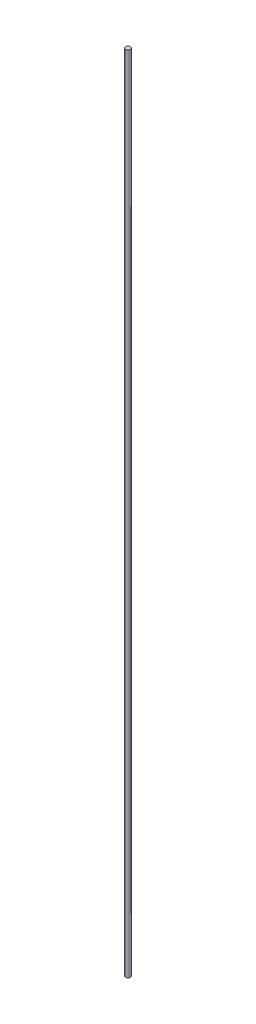
ISO-10303-21;
HEADER;
FILE_DESCRIPTION(('STEP AP214'),'2;1');
FILE_NAME('part.step','',(''),(''),'','','');
FILE_SCHEMA(('AUTOMOTIVE_DESIGN { 1 0 10303 214 1 1 1 1 }'));
ENDSEC;
DATA;
#1=APPLICATION_CONTEXT('core data for automotive mechanical design processes');
#2=APPLICATION_PROTOCOL_DEFINITION('international standard','automotive_design',2000,#1);
#3=PRODUCT_CONTEXT('',#1,'mechanical');
#4=PRODUCT('Part','Part','',(#3));
#5=PRODUCT_RELATED_PRODUCT_CATEGORY('part','',(#4));
#6=PRODUCT_DEFINITION_FORMATION('','',#4);
#7=PRODUCT_DEFINITION_CONTEXT('part definition',#1,'design');
#8=PRODUCT_DEFINITION('design','',#6,#7);
#9=PRODUCT_DEFINITION_SHAPE('','',#8);
#10=(LENGTH_UNIT() NAMED_UNIT(*) SI_UNIT(.MILLI.,.METRE.));
#11=(NAMED_UNIT(*) PLANE_ANGLE_UNIT() SI_UNIT($,.RADIAN.));
#12=(NAMED_UNIT(*) SI_UNIT($,.STERADIAN.) SOLID_ANGLE_UNIT());
#13=UNCERTAINTY_MEASURE_WITH_UNIT(LENGTH_MEASURE(1.E-05),#10,'distance_accuracy_value','');
#14=(GEOMETRIC_REPRESENTATION_CONTEXT(3) GLOBAL_UNCERTAINTY_ASSIGNED_CONTEXT((#13)) GLOBAL_UNIT_ASSIGNED_CONTEXT((#10,
#11,#12)) REPRESENTATION_CONTEXT('',''));
#15=CARTESIAN_POINT('',(0.,0.,0.));
#16=DIRECTION('',(0.,0.,1.));
#17=DIRECTION('',(1.,0.,0.));
#18=AXIS2_PLACEMENT_3D('',#15,#16,#17);
#19=CARTESIAN_POINT('',(0.,1000.,0.));
#20=DIRECTION('',(0.,-1.,0.));
#21=DIRECTION('',(0.,0.,-1.));
#22=AXIS2_PLACEMENT_3D('',#19,#20,#21);
#23=CYLINDRICAL_SURFACE('',#22,3.);
#24=CARTESIAN_POINT('',(0.,1000.,0.));
#25=DIRECTION('',(0.,1.,0.));
#26=DIRECTION('',(0.,0.,1.));
#27=AXIS2_PLACEMENT_3D('',#24,#25,#26);
#28=CIRCLE('',#27,3.);
#29=CARTESIAN_POINT('',(0.,1000.,3.));
#30=VERTEX_POINT('',#29);
#31=EDGE_CURVE('E10',#30,#30,#28,.T.);
#32=ORIENTED_EDGE('',*,*,#31,.F.);
#33=EDGE_LOOP('',(#32));
#34=FACE_BOUND('',#33,.T.);
#35=CARTESIAN_POINT('',(0.,-6.,0.));
#36=DIRECTION('',(0.,1.,0.));
#37=DIRECTION('',(0.,0.,1.));
#38=AXIS2_PLACEMENT_3D('',#35,#36,#37);
#39=CIRCLE('',#38,3.);
#40=CARTESIAN_POINT('',(0.,-6.,3.));
#41=VERTEX_POINT('',#40);
#42=EDGE_CURVE('E50',#41,#41,#39,.T.);
#43=ORIENTED_EDGE('',*,*,#42,.T.);
#44=EDGE_LOOP('',(#43));
#45=FACE_BOUND('',#44,.T.);
#46=ADVANCED_FACE('F43',(#34,#45),#23,.T.);
#47=CARTESIAN_POINT('',(0.,1000.,0.));
#48=DIRECTION('',(0.,1.,0.));
#49=DIRECTION('',(0.,0.,1.));
#50=AXIS2_PLACEMENT_3D('',#47,#48,#49);
#51=PLANE('',#50);
#52=ORIENTED_EDGE('',*,*,#31,.T.);
#53=EDGE_LOOP('',(#52));
#54=FACE_BOUND('',#53,.T.);
#55=ADVANCED_FACE('F60',(#54),#51,.T.);
#56=CARTESIAN_POINT('',(0.,-6.,0.));
#57=DIRECTION('',(0.,1.,0.));
#58=DIRECTION('',(0.,0.,1.));
#59=AXIS2_PLACEMENT_3D('',#56,#57,#58);
#60=PLANE('',#59);
#61=ORIENTED_EDGE('',*,*,#42,.F.);
#62=EDGE_LOOP('',(#61));
#63=FACE_BOUND('',#62,.T.);
#64=ADVANCED_FACE('F58',(#63),#60,.F.);
#65=CLOSED_SHELL('',(#46,#55,#64));
#66=MANIFOLD_SOLID_BREP('B2',#65);
#67=ADVANCED_BREP_SHAPE_REPRESENTATION('',(#18,#66),#14);
#68=SHAPE_DEFINITION_REPRESENTATION(#9,#67);
ENDSEC;
END-ISO-10303-21;
